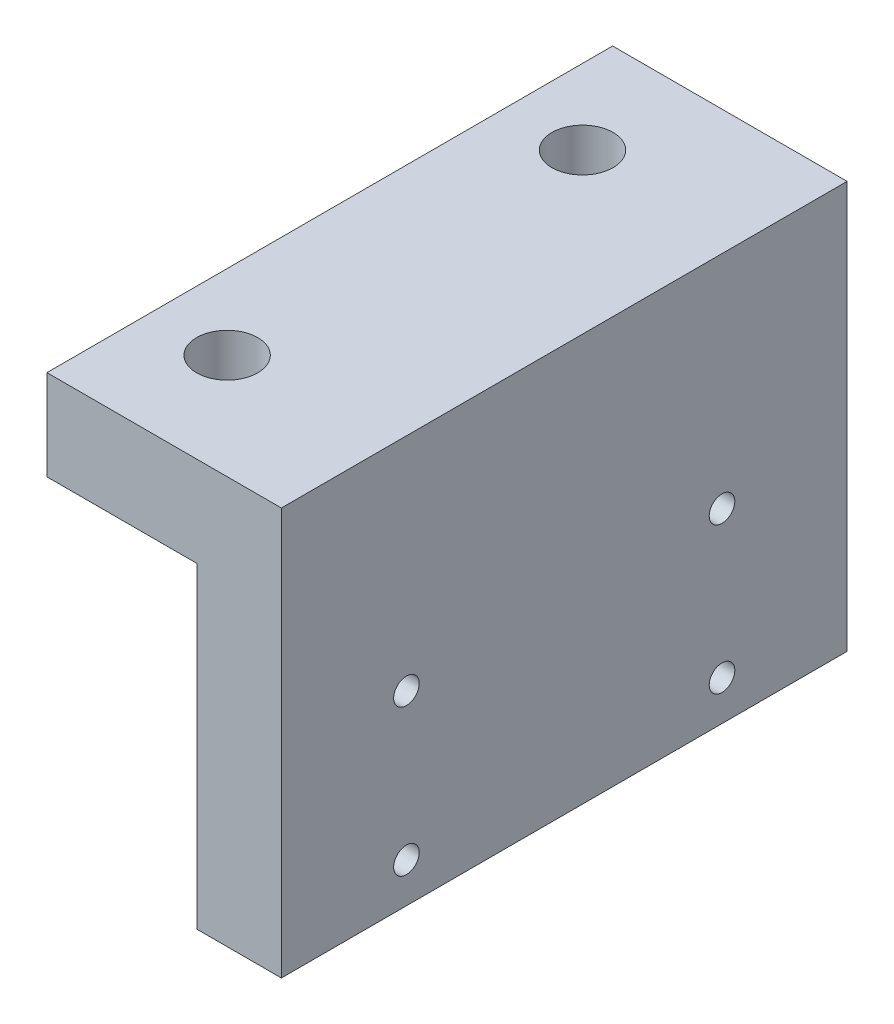
ISO-10303-21;
HEADER;
FILE_DESCRIPTION(('STEP AP214'),'2;1');
FILE_NAME('part.step','',(''),(''),'','','');
FILE_SCHEMA(('AUTOMOTIVE_DESIGN { 1 0 10303 214 1 1 1 1 }'));
ENDSEC;
DATA;
#1=APPLICATION_CONTEXT('core data for automotive mechanical design processes');
#2=APPLICATION_PROTOCOL_DEFINITION('international standard','automotive_design',2000,#1);
#3=PRODUCT_CONTEXT('',#1,'mechanical');
#4=PRODUCT('Part','Part','',(#3));
#5=PRODUCT_RELATED_PRODUCT_CATEGORY('part','',(#4));
#6=PRODUCT_DEFINITION_FORMATION('','',#4);
#7=PRODUCT_DEFINITION_CONTEXT('part definition',#1,'design');
#8=PRODUCT_DEFINITION('design','',#6,#7);
#9=PRODUCT_DEFINITION_SHAPE('','',#8);
#10=(LENGTH_UNIT() NAMED_UNIT(*) SI_UNIT(.MILLI.,.METRE.));
#11=(NAMED_UNIT(*) PLANE_ANGLE_UNIT() SI_UNIT($,.RADIAN.));
#12=(NAMED_UNIT(*) SI_UNIT($,.STERADIAN.) SOLID_ANGLE_UNIT());
#13=UNCERTAINTY_MEASURE_WITH_UNIT(LENGTH_MEASURE(1.E-05),#10,'distance_accuracy_value','');
#14=(GEOMETRIC_REPRESENTATION_CONTEXT(3) GLOBAL_UNCERTAINTY_ASSIGNED_CONTEXT((#13)) GLOBAL_UNIT_ASSIGNED_CONTEXT((#10,
#11,#12)) REPRESENTATION_CONTEXT('',''));
#15=CARTESIAN_POINT('',(0.,0.,0.));
#16=DIRECTION('',(0.,0.,1.));
#17=DIRECTION('',(1.,0.,0.));
#18=AXIS2_PLACEMENT_3D('',#15,#16,#17);
#19=CARTESIAN_POINT('',(399994.85,-6.34999999988395,366.44831964339));
#20=DIRECTION('',(0.,1.,0.));
#21=DIRECTION('',(-1.,0.,0.));
#22=AXIS2_PLACEMENT_3D('',#19,#20,#21);
#23=PLANE('',#22);
#24=CARTESIAN_POINT('',(-5.27999999999997,-6.35000000001537,300.999999981));
#25=DIRECTION('',(0.,1.,0.));
#26=DIRECTION('',(-1.,0.,0.));
#27=AXIS2_PLACEMENT_3D('',#24,#25,#26);
#28=CIRCLE('',#27,5.27999999999998);
#29=CARTESIAN_POINT('',(-5.27999999999997,-6.35000000001537,295.719999981001));
#30=VERTEX_POINT('',#29);
#31=CARTESIAN_POINT('',(-1.77887218844042E-11,-6.35000000001537,300.999999981));
#32=VERTEX_POINT('',#31);
#33=EDGE_CURVE('E221',#30,#32,#28,.F.);
#34=ORIENTED_EDGE('',*,*,#33,.F.);
#35=DIRECTION('',(1.,0.,0.));
#36=VECTOR('',#35,1.);
#37=CARTESIAN_POINT('',(-5.27999999999998,-6.35000000001537,295.719999981001));
#38=LINE('',#37,#36);
#39=CARTESIAN_POINT('',(-10.5599999999999,-6.35000000001537,295.719999981001));
#40=VERTEX_POINT('',#39);
#41=EDGE_CURVE('E232',#40,#30,#38,.T.);
#42=ORIENTED_EDGE('',*,*,#41,.F.);
#43=DIRECTION('',(0.,0.,-1.));
#44=VECTOR('',#43,1.);
#45=CARTESIAN_POINT('',(-10.5599999999981,-6.35000000001537,366.44831964339));
#46=LINE('',#45,#44);
#47=CARTESIAN_POINT('',(-10.5599999999981,-6.35000000001537,293.600000000001));
#48=VERTEX_POINT('',#47);
#49=EDGE_CURVE('E172',#40,#48,#46,.T.);
#50=ORIENTED_EDGE('',*,*,#49,.T.);
#51=DIRECTION('',(1.,0.,0.));
#52=VECTOR('',#51,1.);
#53=CARTESIAN_POINT('',(399994.85,-6.34999999988395,293.600000000001));
#54=LINE('',#53,#52);
#55=CARTESIAN_POINT('',(-1.77890337023119E-11,-6.34999999999764,293.600000000001));
#56=VERTEX_POINT('',#55);
#57=EDGE_CURVE('E175',#48,#56,#54,.T.);
#58=ORIENTED_EDGE('',*,*,#57,.T.);
#59=DIRECTION('',(0.,0.,-1.));
#60=VECTOR('',#59,1.);
#61=CARTESIAN_POINT('',(-2.1316282072803E-11,-6.34999999999764,366.44831964339));
#62=LINE('',#61,#60);
#63=EDGE_CURVE('E185',#32,#56,#62,.T.);
#64=ORIENTED_EDGE('',*,*,#63,.F.);
#65=EDGE_LOOP('',(#34,#42,#50,#58,#64));
#66=FACE_BOUND('',#65,.T.);
#67=ADVANCED_FACE('F35',(#66),#23,.F.);
#68=DIRECTION('',(-1.,0.,0.));
#69=VECTOR('',#68,1.);
#70=CARTESIAN_POINT('',(-10.5599999999999,-6.35000000001537,306.279999981));
#71=LINE('',#70,#69);
#72=CARTESIAN_POINT('',(-5.27999999999997,-6.35000000001537,306.279999981));
#73=VERTEX_POINT('',#72);
#74=CARTESIAN_POINT('',(-10.5599999999981,-6.35000000001537,306.279999981));
#75=VERTEX_POINT('',#74);
#76=EDGE_CURVE('E145',#73,#75,#71,.T.);
#77=ORIENTED_EDGE('',*,*,#76,.F.);
#78=EDGE_CURVE('E217',#32,#73,#28,.F.);
#79=ORIENTED_EDGE('',*,*,#78,.F.);
#80=CARTESIAN_POINT('',(0.,-6.35000000001537,326.000000019));
#81=VERTEX_POINT('',#80);
#82=EDGE_CURVE('E184',#81,#32,#62,.T.);
#83=ORIENTED_EDGE('',*,*,#82,.F.);
#84=CARTESIAN_POINT('',(-5.27999999999997,-6.35000000001537,326.000000019));
#85=DIRECTION('',(0.,1.,0.));
#86=DIRECTION('',(-1.,0.,0.));
#87=AXIS2_PLACEMENT_3D('',#84,#85,#86);
#88=CIRCLE('',#87,5.27999999999995);
#89=CARTESIAN_POINT('',(-5.27999999999997,-6.35000000001537,320.720000019));
#90=VERTEX_POINT('',#89);
#91=EDGE_CURVE('E154',#90,#81,#88,.F.);
#92=ORIENTED_EDGE('',*,*,#91,.F.);
#93=DIRECTION('',(1.,0.,0.));
#94=VECTOR('',#93,1.);
#95=CARTESIAN_POINT('',(-5.27999999999998,-6.35000000001537,320.720000019));
#96=LINE('',#95,#94);
#97=CARTESIAN_POINT('',(-10.5599999999999,-6.35000000001537,320.720000019));
#98=VERTEX_POINT('',#97);
#99=EDGE_CURVE('E170',#98,#90,#96,.T.);
#100=ORIENTED_EDGE('',*,*,#99,.F.);
#101=EDGE_CURVE('E162',#98,#75,#46,.T.);
#102=ORIENTED_EDGE('',*,*,#101,.T.);
#103=EDGE_LOOP('',(#77,#79,#83,#92,#100,#102));
#104=FACE_BOUND('',#103,.T.);
#105=ADVANCED_FACE('F167',(#104),#23,.F.);
#106=CARTESIAN_POINT('',(-5.6843418860808E-11,291573.6475,365.160929319702));
#107=DIRECTION('',(-1.,0.,0.));
#108=DIRECTION('',(0.,-1.,0.));
#109=AXIS2_PLACEMENT_3D('',#106,#107,#108);
#110=PLANE('',#109);
#111=CARTESIAN_POINT('',(0.,-25.8374999999995,302.4));
#112=DIRECTION('',(-1.,0.,0.));
#113=DIRECTION('',(0.,0.,1.));
#114=AXIS2_PLACEMENT_3D('',#111,#112,#113);
#115=CIRCLE('',#114,0.899999999999998);
#116=CARTESIAN_POINT('',(0.,-25.8374999999995,303.3));
#117=VERTEX_POINT('',#116);
#118=EDGE_CURVE('E369',#117,#117,#115,.T.);
#119=ORIENTED_EDGE('',*,*,#118,.F.);
#120=EDGE_LOOP('',(#119));
#121=FACE_BOUND('',#120,.T.);
#122=CARTESIAN_POINT('',(0.,-15.5374999999995,302.4));
#123=DIRECTION('',(-1.,0.,0.));
#124=DIRECTION('',(0.,0.,1.));
#125=AXIS2_PLACEMENT_3D('',#122,#123,#124);
#126=CIRCLE('',#125,0.899999999999998);
#127=CARTESIAN_POINT('',(0.,-15.5374999999995,303.3));
#128=VERTEX_POINT('',#127);
#129=EDGE_CURVE('E373',#128,#128,#126,.T.);
#130=ORIENTED_EDGE('',*,*,#129,.F.);
#131=EDGE_LOOP('',(#130));
#132=FACE_BOUND('',#131,.T.);
#133=CARTESIAN_POINT('',(0.,-15.5374999999995,324.6));
#134=DIRECTION('',(-1.,0.,0.));
#135=DIRECTION('',(0.,0.,1.));
#136=AXIS2_PLACEMENT_3D('',#133,#134,#135);
#137=CIRCLE('',#136,0.899999999999998);
#138=CARTESIAN_POINT('',(0.,-15.5374999999995,325.5));
#139=VERTEX_POINT('',#138);
#140=EDGE_CURVE('E377',#139,#139,#137,.T.);
#141=ORIENTED_EDGE('',*,*,#140,.F.);
#142=EDGE_LOOP('',(#141));
#143=FACE_BOUND('',#142,.T.);
#144=CARTESIAN_POINT('',(0.,-25.8374999999995,324.6));
#145=DIRECTION('',(-1.,0.,0.));
#146=DIRECTION('',(0.,0.,1.));
#147=AXIS2_PLACEMENT_3D('',#144,#145,#146);
#148=CIRCLE('',#147,0.899999999999998);
#149=CARTESIAN_POINT('',(0.,-25.8374999999995,325.5));
#150=VERTEX_POINT('',#149);
#151=EDGE_CURVE('E380',#150,#150,#148,.T.);
#152=ORIENTED_EDGE('',*,*,#151,.F.);
#153=EDGE_LOOP('',(#152));
#154=FACE_BOUND('',#153,.T.);
#155=DIRECTION('',(0.,1.,0.));
#156=VECTOR('',#155,1.);
#157=CARTESIAN_POINT('',(-5.6843418860808E-11,291573.6475,333.400000000089));
#158=LINE('',#157,#156);
#159=CARTESIAN_POINT('',(0.,-28.6375000000021,333.4));
#160=VERTEX_POINT('',#159);
#161=CARTESIAN_POINT('',(-1.77890337023119E-11,-6.34999999999764,333.4));
#162=VERTEX_POINT('',#161);
#163=EDGE_CURVE('E44',#160,#162,#158,.T.);
#164=ORIENTED_EDGE('',*,*,#163,.T.);
#165=EDGE_CURVE('E180',#162,#81,#62,.T.);
#166=ORIENTED_EDGE('',*,*,#165,.T.);
#167=ORIENTED_EDGE('',*,*,#82,.T.);
#168=ORIENTED_EDGE('',*,*,#63,.T.);
#169=DIRECTION('',(0.,1.,0.));
#170=VECTOR('',#169,1.);
#171=CARTESIAN_POINT('',(-5.6843418860808E-11,291573.6475,293.600000000001));
#172=LINE('',#171,#170);
#173=CARTESIAN_POINT('',(0.,-28.6375000000021,293.600000000001));
#174=VERTEX_POINT('',#173);
#175=EDGE_CURVE('E200',#174,#56,#172,.T.);
#176=ORIENTED_EDGE('',*,*,#175,.F.);
#177=DIRECTION('',(0.,0.,-1.));
#178=VECTOR('',#177,1.);
#179=CARTESIAN_POINT('',(0.,-28.6375000000021,365.160929319702));
#180=LINE('',#179,#178);
#181=EDGE_CURVE('E205',#160,#174,#180,.T.);
#182=ORIENTED_EDGE('',*,*,#181,.F.);
#183=EDGE_LOOP('',(#164,#166,#167,#168,#176,#182));
#184=FACE_BOUND('',#183,.T.);
#185=ADVANCED_FACE('F296',(#121,#132,#143,#154,#184),#110,.T.);
#186=CARTESIAN_POINT('',(-5.15,-25.8374999999995,333.4));
#187=DIRECTION('',(0.,0.,1.));
#188=DIRECTION('',(0.,-1.,0.));
#189=AXIS2_PLACEMENT_3D('',#186,#187,#188);
#190=PLANE('',#189);
#191=DIRECTION('',(0.,1.,0.));
#192=VECTOR('',#191,1.);
#193=CARTESIAN_POINT('',(-10.5599999993728,291573.647500001,333.400000000089));
#194=LINE('',#193,#192);
#195=CARTESIAN_POINT('',(-10.5599999999981,-6.35000000001537,333.4));
#196=VERTEX_POINT('',#195);
#197=CARTESIAN_POINT('',(-10.5600000000101,0.,333.4));
#198=VERTEX_POINT('',#197);
#199=EDGE_CURVE('E194',#196,#198,#194,.T.);
#200=ORIENTED_EDGE('',*,*,#199,.F.);
#201=DIRECTION('',(1.,0.,0.));
#202=VECTOR('',#201,1.);
#203=CARTESIAN_POINT('',(399994.85,-6.34999999988395,333.400000000004));
#204=LINE('',#203,#202);
#205=EDGE_CURVE('E203',#196,#162,#204,.T.);
#206=ORIENTED_EDGE('',*,*,#205,.T.);
#207=ORIENTED_EDGE('',*,*,#163,.F.);
#208=DIRECTION('',(-1.,0.,0.));
#209=VECTOR('',#208,1.);
#210=CARTESIAN_POINT('',(399994.85,-28.6375000000021,333.400000000004));
#211=LINE('',#210,#209);
#212=CARTESIAN_POINT('',(5.93500000002223,-28.6375000000109,333.4));
#213=VERTEX_POINT('',#212);
#214=EDGE_CURVE('E206',#213,#160,#211,.T.);
#215=ORIENTED_EDGE('',*,*,#214,.F.);
#216=DIRECTION('',(0.,1.,0.));
#217=VECTOR('',#216,1.);
#218=CARTESIAN_POINT('',(5.93500000002223,291573.6475,333.400000000089));
#219=LINE('',#218,#217);
#220=CARTESIAN_POINT('',(5.93500000002223,-6.91903029935933E-12,333.4));
#221=VERTEX_POINT('',#220);
#222=EDGE_CURVE('E183',#213,#221,#219,.T.);
#223=ORIENTED_EDGE('',*,*,#222,.T.);
#224=DIRECTION('',(1.,0.,0.));
#225=VECTOR('',#224,1.);
#226=CARTESIAN_POINT('',(399994.85,-5.6843418860808E-11,333.400000000004));
#227=LINE('',#226,#225);
#228=EDGE_CURVE('E209',#198,#221,#227,.T.);
#229=ORIENTED_EDGE('',*,*,#228,.F.);
#230=EDGE_LOOP('',(#200,#206,#207,#215,#223,#229));
#231=FACE_BOUND('',#230,.T.);
#232=ADVANCED_FACE('F37',(#231),#190,.T.);
#233=CARTESIAN_POINT('',(0.,0.,293.600000000001));
#234=DIRECTION('',(0.,0.,1.));
#235=DIRECTION('',(1.,0.,0.));
#236=AXIS2_PLACEMENT_3D('',#233,#234,#235);
#237=PLANE('',#236);
#238=ORIENTED_EDGE('',*,*,#57,.F.);
#239=DIRECTION('',(0.,1.,0.));
#240=VECTOR('',#239,1.);
#241=CARTESIAN_POINT('',(-10.5599999993728,291573.647500001,293.600000000001));
#242=LINE('',#241,#240);
#243=CARTESIAN_POINT('',(-10.5599999999981,-7.92464876984099E-12,293.600000000001));
#244=VERTEX_POINT('',#243);
#245=EDGE_CURVE('E197',#48,#244,#242,.T.);
#246=ORIENTED_EDGE('',*,*,#245,.T.);
#247=DIRECTION('',(1.,0.,0.));
#248=VECTOR('',#247,1.);
#249=CARTESIAN_POINT('',(399994.85,-5.6843418860808E-11,293.600000000001));
#250=LINE('',#249,#248);
#251=CARTESIAN_POINT('',(5.93500000002223,-6.91903029935933E-12,293.600000000001));
#252=VERTEX_POINT('',#251);
#253=EDGE_CURVE('E195',#244,#252,#250,.T.);
#254=ORIENTED_EDGE('',*,*,#253,.T.);
#255=DIRECTION('',(0.,1.,0.));
#256=VECTOR('',#255,1.);
#257=CARTESIAN_POINT('',(5.93500000002223,291573.6475,293.600000000001));
#258=LINE('',#257,#256);
#259=CARTESIAN_POINT('',(5.93500000002223,-28.6375000000109,293.600000000001));
#260=VERTEX_POINT('',#259);
#261=EDGE_CURVE('E189',#260,#252,#258,.T.);
#262=ORIENTED_EDGE('',*,*,#261,.F.);
#263=DIRECTION('',(-1.,0.,0.));
#264=VECTOR('',#263,1.);
#265=CARTESIAN_POINT('',(399994.85,-28.6375000000021,293.600000000001));
#266=LINE('',#265,#264);
#267=EDGE_CURVE('E191',#260,#174,#266,.T.);
#268=ORIENTED_EDGE('',*,*,#267,.T.);
#269=ORIENTED_EDGE('',*,*,#175,.T.);
#270=EDGE_LOOP('',(#238,#246,#254,#262,#268,#269));
#271=FACE_BOUND('',#270,.T.);
#272=ADVANCED_FACE('F303',(#271),#237,.F.);
#273=CARTESIAN_POINT('',(-10.5599999993728,291573.647500001,365.160929319702));
#274=DIRECTION('',(-1.,0.,0.));
#275=DIRECTION('',(0.,-1.,0.));
#276=AXIS2_PLACEMENT_3D('',#273,#274,#275);
#277=PLANE('',#276);
#278=DIRECTION('',(0.,1.,0.));
#279=VECTOR('',#278,1.);
#280=CARTESIAN_POINT('',(-10.5599999999999,-28.6385000000109,295.719999981001));
#281=LINE('',#280,#279);
#282=CARTESIAN_POINT('',(-10.5599999999999,-3.175,295.719999981001));
#283=VERTEX_POINT('',#282);
#284=EDGE_CURVE('E155',#40,#283,#281,.T.);
#285=ORIENTED_EDGE('',*,*,#284,.T.);
#286=DIRECTION('',(0.,0.,1.));
#287=VECTOR('',#286,1.);
#288=CARTESIAN_POINT('',(-10.5599999999999,-3.175,295.719999981001));
#289=LINE('',#288,#287);
#290=CARTESIAN_POINT('',(-10.5600000000101,-3.17499999999882,306.279999981));
#291=VERTEX_POINT('',#290);
#292=EDGE_CURVE('E163',#283,#291,#289,.T.);
#293=ORIENTED_EDGE('',*,*,#292,.T.);
#294=DIRECTION('',(0.,1.,0.));
#295=VECTOR('',#294,1.);
#296=CARTESIAN_POINT('',(-10.5599999999999,-28.6385000000109,306.279999981));
#297=LINE('',#296,#295);
#298=EDGE_CURVE('E148',#75,#291,#297,.T.);
#299=ORIENTED_EDGE('',*,*,#298,.F.);
#300=ORIENTED_EDGE('',*,*,#101,.F.);
#301=DIRECTION('',(0.,1.,0.));
#302=VECTOR('',#301,1.);
#303=CARTESIAN_POINT('',(-10.5599999999999,-28.6385000000109,320.720000019));
#304=LINE('',#303,#302);
#305=CARTESIAN_POINT('',(-10.5599999999999,-3.175,320.720000019));
#306=VERTEX_POINT('',#305);
#307=EDGE_CURVE('E260',#98,#306,#304,.T.);
#308=ORIENTED_EDGE('',*,*,#307,.T.);
#309=DIRECTION('',(0.,0.,1.));
#310=VECTOR('',#309,1.);
#311=CARTESIAN_POINT('',(-10.5599999999999,-3.175,320.720000019));
#312=LINE('',#311,#310);
#313=CARTESIAN_POINT('',(-10.5599999999999,-3.175,331.280000019));
#314=VERTEX_POINT('',#313);
#315=EDGE_CURVE('E248',#306,#314,#312,.T.);
#316=ORIENTED_EDGE('',*,*,#315,.T.);
#317=DIRECTION('',(0.,1.,0.));
#318=VECTOR('',#317,1.);
#319=CARTESIAN_POINT('',(-10.5599999999999,-28.6385000000109,331.280000019));
#320=LINE('',#319,#318);
#321=CARTESIAN_POINT('',(-10.5599999999981,-6.35000000001537,331.280000019));
#322=VERTEX_POINT('',#321);
#323=EDGE_CURVE('E259',#322,#314,#320,.T.);
#324=ORIENTED_EDGE('',*,*,#323,.F.);
#325=EDGE_CURVE('E171',#196,#322,#46,.T.);
#326=ORIENTED_EDGE('',*,*,#325,.F.);
#327=ORIENTED_EDGE('',*,*,#199,.T.);
#328=DIRECTION('',(0.,0.,-1.));
#329=VECTOR('',#328,1.);
#330=CARTESIAN_POINT('',(-10.5599999999981,-7.92464876984099E-12,365.160929319702));
#331=LINE('',#330,#329);
#332=EDGE_CURVE('E211',#198,#244,#331,.T.);
#333=ORIENTED_EDGE('',*,*,#332,.T.);
#334=ORIENTED_EDGE('',*,*,#245,.F.);
#335=ORIENTED_EDGE('',*,*,#49,.F.);
#336=EDGE_LOOP('',(#285,#293,#299,#300,#308,#316,#324,#326,#327,#333,#334,#335));
#337=FACE_BOUND('',#336,.T.);
#338=ADVANCED_FACE('F160',(#337),#277,.T.);
#339=CARTESIAN_POINT('',(399994.85,-5.6843418860808E-11,365.160929319702));
#340=DIRECTION('',(0.,1.,0.));
#341=DIRECTION('',(-1.,0.,0.));
#342=AXIS2_PLACEMENT_3D('',#339,#340,#341);
#343=PLANE('',#342);
#344=CARTESIAN_POINT('',(-5.27999999999997,0.,300.999999981));
#345=DIRECTION('',(0.,1.,0.));
#346=DIRECTION('',(0.,0.,1.));
#347=AXIS2_PLACEMENT_3D('',#344,#345,#346);
#348=CIRCLE('',#347,2.15000000000004);
#349=CARTESIAN_POINT('',(-5.27999999999997,0.,303.149999981001));
#350=VERTEX_POINT('',#349);
#351=EDGE_CURVE('E228',#350,#350,#348,.T.);
#352=ORIENTED_EDGE('',*,*,#351,.F.);
#353=EDGE_LOOP('',(#352));
#354=FACE_BOUND('',#353,.T.);
#355=CARTESIAN_POINT('',(-5.27999999999997,0.,326.000000019));
#356=DIRECTION('',(0.,1.,0.));
#357=DIRECTION('',(0.,0.,1.));
#358=AXIS2_PLACEMENT_3D('',#355,#356,#357);
#359=CIRCLE('',#358,2.15000000000004);
#360=CARTESIAN_POINT('',(-5.27999999999997,0.,328.150000019));
#361=VERTEX_POINT('',#360);
#362=EDGE_CURVE('E218',#361,#361,#359,.T.);
#363=ORIENTED_EDGE('',*,*,#362,.F.);
#364=EDGE_LOOP('',(#363));
#365=FACE_BOUND('',#364,.T.);
#366=ORIENTED_EDGE('',*,*,#332,.F.);
#367=ORIENTED_EDGE('',*,*,#228,.T.);
#368=DIRECTION('',(0.,0.,-1.));
#369=VECTOR('',#368,1.);
#370=CARTESIAN_POINT('',(5.93500000002223,-6.91903029935933E-12,366.44831964339));
#371=LINE('',#370,#369);
#372=EDGE_CURVE('E176',#221,#252,#371,.T.);
#373=ORIENTED_EDGE('',*,*,#372,.T.);
#374=ORIENTED_EDGE('',*,*,#253,.F.);
#375=EDGE_LOOP('',(#366,#367,#373,#374));
#376=FACE_BOUND('',#375,.T.);
#377=ADVANCED_FACE('F284',(#354,#365,#376),#343,.T.);
#378=CARTESIAN_POINT('',(399994.85,-28.6375000000021,365.160929319702));
#379=DIRECTION('',(0.,-1.,0.));
#380=DIRECTION('',(0.,0.,-1.));
#381=AXIS2_PLACEMENT_3D('',#378,#379,#380);
#382=PLANE('',#381);
#383=ORIENTED_EDGE('',*,*,#267,.F.);
#384=DIRECTION('',(0.,0.,-1.));
#385=VECTOR('',#384,1.);
#386=CARTESIAN_POINT('',(5.93500000002223,-28.6375000000109,366.44831964339));
#387=LINE('',#386,#385);
#388=EDGE_CURVE('E186',#213,#260,#387,.T.);
#389=ORIENTED_EDGE('',*,*,#388,.F.);
#390=ORIENTED_EDGE('',*,*,#214,.T.);
#391=ORIENTED_EDGE('',*,*,#181,.T.);
#392=EDGE_LOOP('',(#383,#389,#390,#391));
#393=FACE_BOUND('',#392,.T.);
#394=ADVANCED_FACE('F300',(#393),#382,.T.);
#395=DIRECTION('',(-1.,0.,0.));
#396=VECTOR('',#395,1.);
#397=CARTESIAN_POINT('',(-10.5599999999999,-6.35000000001537,331.280000019));
#398=LINE('',#397,#396);
#399=CARTESIAN_POINT('',(-5.27999999997064,-6.35000000001537,331.280000019));
#400=VERTEX_POINT('',#399);
#401=EDGE_CURVE('E190',#400,#322,#398,.T.);
#402=ORIENTED_EDGE('',*,*,#401,.F.);
#403=CARTESIAN_POINT('',(-5.27999999999997,-6.35000000001537,326.000000019));
#404=DIRECTION('',(0.,1.,0.));
#405=DIRECTION('',(-1.,0.,0.));
#406=AXIS2_PLACEMENT_3D('',#403,#404,#405);
#407=CIRCLE('',#406,5.27999999999995);
#408=EDGE_CURVE('E11',#400,#81,#407,.T.);
#409=ORIENTED_EDGE('',*,*,#408,.T.);
#410=ORIENTED_EDGE('',*,*,#165,.F.);
#411=ORIENTED_EDGE('',*,*,#205,.F.);
#412=ORIENTED_EDGE('',*,*,#325,.T.);
#413=EDGE_LOOP('',(#402,#409,#410,#411,#412));
#414=FACE_BOUND('',#413,.T.);
#415=ADVANCED_FACE('F292',(#414),#23,.F.);
#416=CARTESIAN_POINT('',(5.93500000002223,291573.6475,366.44831964339));
#417=DIRECTION('',(-1.,0.,0.));
#418=DIRECTION('',(0.,-1.,0.));
#419=AXIS2_PLACEMENT_3D('',#416,#417,#418);
#420=PLANE('',#419);
#421=CARTESIAN_POINT('',(5.93500000002223,-25.8374999999995,302.4));
#422=DIRECTION('',(-1.,0.,0.));
#423=DIRECTION('',(0.,0.,1.));
#424=AXIS2_PLACEMENT_3D('',#421,#422,#423);
#425=CIRCLE('',#424,0.899999999999998);
#426=CARTESIAN_POINT('',(5.93500000002223,-25.8374999999995,303.3));
#427=VERTEX_POINT('',#426);
#428=EDGE_CURVE('E394',#427,#427,#425,.T.);
#429=ORIENTED_EDGE('',*,*,#428,.T.);
#430=EDGE_LOOP('',(#429));
#431=FACE_BOUND('',#430,.T.);
#432=CARTESIAN_POINT('',(5.93500000002223,-15.5374999999995,302.4));
#433=DIRECTION('',(-1.,0.,0.));
#434=DIRECTION('',(0.,0.,1.));
#435=AXIS2_PLACEMENT_3D('',#432,#433,#434);
#436=CIRCLE('',#435,0.899999999999998);
#437=CARTESIAN_POINT('',(5.93500000002223,-15.5374999999995,303.3));
#438=VERTEX_POINT('',#437);
#439=EDGE_CURVE('E390',#438,#438,#436,.T.);
#440=ORIENTED_EDGE('',*,*,#439,.T.);
#441=EDGE_LOOP('',(#440));
#442=FACE_BOUND('',#441,.T.);
#443=CARTESIAN_POINT('',(5.93500000002223,-15.5374999999995,324.6));
#444=DIRECTION('',(-1.,0.,0.));
#445=DIRECTION('',(0.,0.,1.));
#446=AXIS2_PLACEMENT_3D('',#443,#444,#445);
#447=CIRCLE('',#446,0.899999999999998);
#448=CARTESIAN_POINT('',(5.93500000002223,-15.5374999999995,325.5));
#449=VERTEX_POINT('',#448);
#450=EDGE_CURVE('E383',#449,#449,#447,.T.);
#451=ORIENTED_EDGE('',*,*,#450,.T.);
#452=EDGE_LOOP('',(#451));
#453=FACE_BOUND('',#452,.T.);
#454=CARTESIAN_POINT('',(5.93500000002223,-25.8374999999995,324.6));
#455=DIRECTION('',(-1.,0.,0.));
#456=DIRECTION('',(0.,0.,1.));
#457=AXIS2_PLACEMENT_3D('',#454,#455,#456);
#458=CIRCLE('',#457,0.899999999999998);
#459=CARTESIAN_POINT('',(5.93500000002223,-25.8374999999995,325.5));
#460=VERTEX_POINT('',#459);
#461=EDGE_CURVE('E382',#460,#460,#458,.T.);
#462=ORIENTED_EDGE('',*,*,#461,.T.);
#463=EDGE_LOOP('',(#462));
#464=FACE_BOUND('',#463,.T.);
#465=ORIENTED_EDGE('',*,*,#222,.F.);
#466=ORIENTED_EDGE('',*,*,#388,.T.);
#467=ORIENTED_EDGE('',*,*,#261,.T.);
#468=ORIENTED_EDGE('',*,*,#372,.F.);
#469=EDGE_LOOP('',(#465,#466,#467,#468));
#470=FACE_BOUND('',#469,.T.);
#471=ADVANCED_FACE('F279',(#431,#442,#453,#464,#470),#420,.F.);
#472=CARTESIAN_POINT('',(-5.27999999999997,-28.6385000000109,320.720000019));
#473=DIRECTION('',(0.,0.,-1.));
#474=DIRECTION('',(-1.,0.,0.));
#475=AXIS2_PLACEMENT_3D('',#472,#473,#474);
#476=PLANE('',#475);
#477=ORIENTED_EDGE('',*,*,#99,.T.);
#478=DIRECTION('',(0.,1.,0.));
#479=VECTOR('',#478,1.);
#480=CARTESIAN_POINT('',(-5.27999999999997,-28.6385000000109,320.720000019));
#481=LINE('',#480,#479);
#482=CARTESIAN_POINT('',(-5.27999999999997,-3.175,320.720000019));
#483=VERTEX_POINT('',#482);
#484=EDGE_CURVE('E262',#90,#483,#481,.T.);
#485=ORIENTED_EDGE('',*,*,#484,.T.);
#486=DIRECTION('',(-1.,0.,0.));
#487=VECTOR('',#486,1.);
#488=CARTESIAN_POINT('',(-5.27999999999997,-3.175,320.720000019));
#489=LINE('',#488,#487);
#490=EDGE_CURVE('E256',#483,#306,#489,.T.);
#491=ORIENTED_EDGE('',*,*,#490,.T.);
#492=ORIENTED_EDGE('',*,*,#307,.F.);
#493=EDGE_LOOP('',(#477,#485,#491,#492));
#494=FACE_BOUND('',#493,.T.);
#495=ADVANCED_FACE('F320',(#494),#476,.F.);
#496=CARTESIAN_POINT('',(-5.27999999999997,-28.6385000000109,326.000000019));
#497=DIRECTION('',(0.,1.,0.));
#498=DIRECTION('',(0.,0.,1.));
#499=AXIS2_PLACEMENT_3D('',#496,#497,#498);
#500=CYLINDRICAL_SURFACE('',#499,5.27999999999995);
#501=ORIENTED_EDGE('',*,*,#91,.T.);
#502=ORIENTED_EDGE('',*,*,#408,.F.);
#503=DIRECTION('',(0.,1.,0.));
#504=VECTOR('',#503,1.);
#505=CARTESIAN_POINT('',(-5.27999999999997,-28.6385000000109,331.280000019));
#506=LINE('',#505,#504);
#507=CARTESIAN_POINT('',(-5.27999999999997,-3.175,331.280000019));
#508=VERTEX_POINT('',#507);
#509=EDGE_CURVE('E60',#400,#508,#506,.T.);
#510=ORIENTED_EDGE('',*,*,#509,.T.);
#511=CARTESIAN_POINT('',(-5.27999999999997,-3.175,326.000000019));
#512=DIRECTION('',(0.,1.,0.));
#513=DIRECTION('',(0.,0.,1.));
#514=AXIS2_PLACEMENT_3D('',#511,#512,#513);
#515=CIRCLE('',#514,5.27999999999995);
#516=EDGE_CURVE('E253',#508,#483,#515,.T.);
#517=ORIENTED_EDGE('',*,*,#516,.T.);
#518=ORIENTED_EDGE('',*,*,#484,.F.);
#519=EDGE_LOOP('',(#501,#502,#510,#517,#518));
#520=FACE_BOUND('',#519,.T.);
#521=ADVANCED_FACE('F316',(#520),#500,.F.);
#522=CARTESIAN_POINT('',(-10.5599999999999,-28.6385000000109,331.280000019));
#523=DIRECTION('',(0.,0.,1.));
#524=DIRECTION('',(1.,0.,0.));
#525=AXIS2_PLACEMENT_3D('',#522,#523,#524);
#526=PLANE('',#525);
#527=ORIENTED_EDGE('',*,*,#401,.T.);
#528=ORIENTED_EDGE('',*,*,#323,.T.);
#529=DIRECTION('',(1.,0.,0.));
#530=VECTOR('',#529,1.);
#531=CARTESIAN_POINT('',(-10.5599999999999,-3.175,331.280000019));
#532=LINE('',#531,#530);
#533=EDGE_CURVE('E251',#314,#508,#532,.T.);
#534=ORIENTED_EDGE('',*,*,#533,.T.);
#535=ORIENTED_EDGE('',*,*,#509,.F.);
#536=EDGE_LOOP('',(#527,#528,#534,#535));
#537=FACE_BOUND('',#536,.T.);
#538=ADVANCED_FACE('F324',(#537),#526,.F.);
#539=CARTESIAN_POINT('',(-5.27999999999997,-3.175,326.000000019));
#540=DIRECTION('',(0.,1.,0.));
#541=DIRECTION('',(0.,0.,1.));
#542=AXIS2_PLACEMENT_3D('',#539,#540,#541);
#543=PLANE('',#542);
#544=CARTESIAN_POINT('',(-5.27999999999997,-3.175,326.000000019));
#545=DIRECTION('',(0.,1.,0.));
#546=DIRECTION('',(0.,0.,1.));
#547=AXIS2_PLACEMENT_3D('',#544,#545,#546);
#548=CIRCLE('',#547,2.15000000000004);
#549=CARTESIAN_POINT('',(-5.27999999999997,-3.175,328.150000019));
#550=VERTEX_POINT('',#549);
#551=EDGE_CURVE('E215',#550,#550,#548,.T.);
#552=ORIENTED_EDGE('',*,*,#551,.T.);
#553=EDGE_LOOP('',(#552));
#554=FACE_BOUND('',#553,.T.);
#555=ORIENTED_EDGE('',*,*,#315,.F.);
#556=ORIENTED_EDGE('',*,*,#490,.F.);
#557=ORIENTED_EDGE('',*,*,#516,.F.);
#558=ORIENTED_EDGE('',*,*,#533,.F.);
#559=EDGE_LOOP('',(#555,#556,#557,#558));
#560=FACE_BOUND('',#559,.T.);
#561=ADVANCED_FACE('F323',(#554,#560),#543,.F.);
#562=CARTESIAN_POINT('',(-5.27999999999997,-28.6385000000109,295.719999981001));
#563=DIRECTION('',(0.,0.,-1.));
#564=DIRECTION('',(-1.,0.,0.));
#565=AXIS2_PLACEMENT_3D('',#562,#563,#564);
#566=PLANE('',#565);
#567=ORIENTED_EDGE('',*,*,#41,.T.);
#568=DIRECTION('',(0.,1.,0.));
#569=VECTOR('',#568,1.);
#570=CARTESIAN_POINT('',(-5.27999999999997,-28.6385000000109,295.719999981001));
#571=LINE('',#570,#569);
#572=CARTESIAN_POINT('',(-5.27999999999997,-3.175,295.719999981001));
#573=VERTEX_POINT('',#572);
#574=EDGE_CURVE('E243',#30,#573,#571,.T.);
#575=ORIENTED_EDGE('',*,*,#574,.T.);
#576=DIRECTION('',(-1.,0.,0.));
#577=VECTOR('',#576,1.);
#578=CARTESIAN_POINT('',(-5.27999999999997,-3.175,295.719999981001));
#579=LINE('',#578,#577);
#580=EDGE_CURVE('E164',#573,#283,#579,.T.);
#581=ORIENTED_EDGE('',*,*,#580,.T.);
#582=ORIENTED_EDGE('',*,*,#284,.F.);
#583=EDGE_LOOP('',(#567,#575,#581,#582));
#584=FACE_BOUND('',#583,.T.);
#585=ADVANCED_FACE('F310',(#584),#566,.F.);
#586=CARTESIAN_POINT('',(-5.27999999999997,-28.6385000000109,300.999999981));
#587=DIRECTION('',(0.,1.,0.));
#588=DIRECTION('',(0.,0.,1.));
#589=AXIS2_PLACEMENT_3D('',#586,#587,#588);
#590=CYLINDRICAL_SURFACE('',#589,5.27999999999998);
#591=ORIENTED_EDGE('',*,*,#33,.T.);
#592=ORIENTED_EDGE('',*,*,#78,.T.);
#593=DIRECTION('',(0.,1.,0.));
#594=VECTOR('',#593,1.);
#595=CARTESIAN_POINT('',(-5.27999999999997,-28.6385000000109,306.279999981));
#596=LINE('',#595,#594);
#597=CARTESIAN_POINT('',(-5.27999999999997,-3.175,306.279999981));
#598=VERTEX_POINT('',#597);
#599=EDGE_CURVE('E150',#73,#598,#596,.T.);
#600=ORIENTED_EDGE('',*,*,#599,.T.);
#601=CARTESIAN_POINT('',(-5.27999999999997,-3.175,300.999999981));
#602=DIRECTION('',(0.,1.,0.));
#603=DIRECTION('',(0.,0.,1.));
#604=AXIS2_PLACEMENT_3D('',#601,#602,#603);
#605=CIRCLE('',#604,5.27999999999998);
#606=EDGE_CURVE('E237',#598,#573,#605,.T.);
#607=ORIENTED_EDGE('',*,*,#606,.T.);
#608=ORIENTED_EDGE('',*,*,#574,.F.);
#609=EDGE_LOOP('',(#591,#592,#600,#607,#608));
#610=FACE_BOUND('',#609,.T.);
#611=ADVANCED_FACE('F314',(#610),#590,.F.);
#612=CARTESIAN_POINT('',(-10.5599999999999,-28.6385000000109,306.279999981));
#613=DIRECTION('',(0.,0.,1.));
#614=DIRECTION('',(1.,0.,0.));
#615=AXIS2_PLACEMENT_3D('',#612,#613,#614);
#616=PLANE('',#615);
#617=ORIENTED_EDGE('',*,*,#76,.T.);
#618=ORIENTED_EDGE('',*,*,#298,.T.);
#619=DIRECTION('',(1.,0.,0.));
#620=VECTOR('',#619,1.);
#621=CARTESIAN_POINT('',(-10.5599999999999,-3.175,306.279999981));
#622=LINE('',#621,#620);
#623=EDGE_CURVE('E52',#291,#598,#622,.T.);
#624=ORIENTED_EDGE('',*,*,#623,.T.);
#625=ORIENTED_EDGE('',*,*,#599,.F.);
#626=EDGE_LOOP('',(#617,#618,#624,#625));
#627=FACE_BOUND('',#626,.T.);
#628=ADVANCED_FACE('F147',(#627),#616,.F.);
#629=CARTESIAN_POINT('',(-5.27999999999997,-3.175,300.999999981));
#630=DIRECTION('',(0.,1.,0.));
#631=DIRECTION('',(0.,0.,1.));
#632=AXIS2_PLACEMENT_3D('',#629,#630,#631);
#633=PLANE('',#632);
#634=CARTESIAN_POINT('',(-5.27999999999997,-3.175,300.999999981));
#635=DIRECTION('',(0.,1.,0.));
#636=DIRECTION('',(0.,0.,1.));
#637=AXIS2_PLACEMENT_3D('',#634,#635,#636);
#638=CIRCLE('',#637,2.15000000000004);
#639=CARTESIAN_POINT('',(-5.27999999999997,-3.175,303.149999981001));
#640=VERTEX_POINT('',#639);
#641=EDGE_CURVE('E39',#640,#640,#638,.T.);
#642=ORIENTED_EDGE('',*,*,#641,.T.);
#643=EDGE_LOOP('',(#642));
#644=FACE_BOUND('',#643,.T.);
#645=ORIENTED_EDGE('',*,*,#292,.F.);
#646=ORIENTED_EDGE('',*,*,#580,.F.);
#647=ORIENTED_EDGE('',*,*,#606,.F.);
#648=ORIENTED_EDGE('',*,*,#623,.F.);
#649=EDGE_LOOP('',(#645,#646,#647,#648));
#650=FACE_BOUND('',#649,.T.);
#651=ADVANCED_FACE('F312',(#644,#650),#633,.F.);
#652=CARTESIAN_POINT('',(-5.27999999999997,-28.6375000000109,326.000000019));
#653=DIRECTION('',(0.,1.,0.));
#654=DIRECTION('',(0.,0.,1.));
#655=AXIS2_PLACEMENT_3D('',#652,#653,#654);
#656=CYLINDRICAL_SURFACE('',#655,2.15000000000004);
#657=ORIENTED_EDGE('',*,*,#362,.T.);
#658=EDGE_LOOP('',(#657));
#659=FACE_BOUND('',#658,.T.);
#660=ORIENTED_EDGE('',*,*,#551,.F.);
#661=EDGE_LOOP('',(#660));
#662=FACE_BOUND('',#661,.T.);
#663=ADVANCED_FACE('F421',(#659,#662),#656,.F.);
#664=CARTESIAN_POINT('',(-5.27999999999997,-28.6375000000109,300.999999981));
#665=DIRECTION('',(0.,1.,0.));
#666=DIRECTION('',(0.,0.,1.));
#667=AXIS2_PLACEMENT_3D('',#664,#665,#666);
#668=CYLINDRICAL_SURFACE('',#667,2.15000000000004);
#669=ORIENTED_EDGE('',*,*,#351,.T.);
#670=EDGE_LOOP('',(#669));
#671=FACE_BOUND('',#670,.T.);
#672=ORIENTED_EDGE('',*,*,#641,.F.);
#673=EDGE_LOOP('',(#672));
#674=FACE_BOUND('',#673,.T.);
#675=ADVANCED_FACE('F417',(#671,#674),#668,.F.);
#676=CARTESIAN_POINT('',(0.,-25.8374999999995,324.6));
#677=DIRECTION('',(-1.,0.,0.));
#678=DIRECTION('',(0.,0.,1.));
#679=AXIS2_PLACEMENT_3D('',#676,#677,#678);
#680=CYLINDRICAL_SURFACE('',#679,0.899999999999998);
#681=ORIENTED_EDGE('',*,*,#461,.F.);
#682=EDGE_LOOP('',(#681));
#683=FACE_BOUND('',#682,.T.);
#684=ORIENTED_EDGE('',*,*,#151,.T.);
#685=EDGE_LOOP('',(#684));
#686=FACE_BOUND('',#685,.T.);
#687=ADVANCED_FACE('F413',(#683,#686),#680,.F.);
#688=CARTESIAN_POINT('',(0.,-15.5374999999995,324.6));
#689=DIRECTION('',(-1.,0.,0.));
#690=DIRECTION('',(0.,0.,1.));
#691=AXIS2_PLACEMENT_3D('',#688,#689,#690);
#692=CYLINDRICAL_SURFACE('',#691,0.899999999999998);
#693=ORIENTED_EDGE('',*,*,#450,.F.);
#694=EDGE_LOOP('',(#693));
#695=FACE_BOUND('',#694,.T.);
#696=ORIENTED_EDGE('',*,*,#140,.T.);
#697=EDGE_LOOP('',(#696));
#698=FACE_BOUND('',#697,.T.);
#699=ADVANCED_FACE('F406',(#695,#698),#692,.F.);
#700=CARTESIAN_POINT('',(0.,-15.5374999999995,302.4));
#701=DIRECTION('',(-1.,0.,0.));
#702=DIRECTION('',(0.,0.,1.));
#703=AXIS2_PLACEMENT_3D('',#700,#701,#702);
#704=CYLINDRICAL_SURFACE('',#703,0.899999999999998);
#705=ORIENTED_EDGE('',*,*,#439,.F.);
#706=EDGE_LOOP('',(#705));
#707=FACE_BOUND('',#706,.T.);
#708=ORIENTED_EDGE('',*,*,#129,.T.);
#709=EDGE_LOOP('',(#708));
#710=FACE_BOUND('',#709,.T.);
#711=ADVANCED_FACE('F400',(#707,#710),#704,.F.);
#712=CARTESIAN_POINT('',(0.,-25.8374999999995,302.4));
#713=DIRECTION('',(-1.,0.,0.));
#714=DIRECTION('',(0.,0.,1.));
#715=AXIS2_PLACEMENT_3D('',#712,#713,#714);
#716=CYLINDRICAL_SURFACE('',#715,0.899999999999998);
#717=ORIENTED_EDGE('',*,*,#428,.F.);
#718=EDGE_LOOP('',(#717));
#719=FACE_BOUND('',#718,.T.);
#720=ORIENTED_EDGE('',*,*,#118,.T.);
#721=EDGE_LOOP('',(#720));
#722=FACE_BOUND('',#721,.T.);
#723=ADVANCED_FACE('F398',(#719,#722),#716,.F.);
#724=CLOSED_SHELL('',(#67,#105,#185,#232,#272,#338,#377,#394,#415,#471,#495,#521,#538,#561,#585,
#611,#628,#651,#663,#675,#687,#699,#711,#723));
#725=MANIFOLD_SOLID_BREP('B2',#724);
#726=ADVANCED_BREP_SHAPE_REPRESENTATION('',(#18,#725),#14);
#727=SHAPE_DEFINITION_REPRESENTATION(#9,#726);
ENDSEC;
END-ISO-10303-21;
